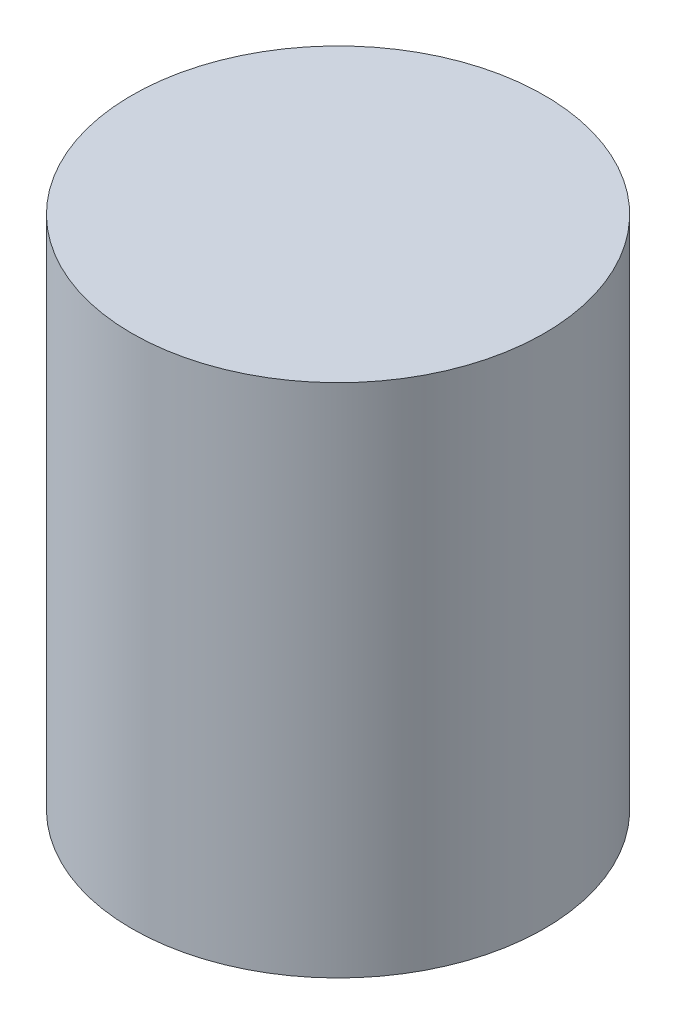
ISO-10303-21;
HEADER;
FILE_DESCRIPTION(('STEP AP214'),'2;1');
FILE_NAME('part.step','',(''),(''),'','','');
FILE_SCHEMA(('AUTOMOTIVE_DESIGN { 1 0 10303 214 1 1 1 1 }'));
ENDSEC;
DATA;
#1=APPLICATION_CONTEXT('core data for automotive mechanical design processes');
#2=APPLICATION_PROTOCOL_DEFINITION('international standard','automotive_design',2000,#1);
#3=PRODUCT_CONTEXT('',#1,'mechanical');
#4=PRODUCT('Part','Part','',(#3));
#5=PRODUCT_RELATED_PRODUCT_CATEGORY('part','',(#4));
#6=PRODUCT_DEFINITION_FORMATION('','',#4);
#7=PRODUCT_DEFINITION_CONTEXT('part definition',#1,'design');
#8=PRODUCT_DEFINITION('design','',#6,#7);
#9=PRODUCT_DEFINITION_SHAPE('','',#8);
#10=(LENGTH_UNIT() NAMED_UNIT(*) SI_UNIT(.MILLI.,.METRE.));
#11=(NAMED_UNIT(*) PLANE_ANGLE_UNIT() SI_UNIT($,.RADIAN.));
#12=(NAMED_UNIT(*) SI_UNIT($,.STERADIAN.) SOLID_ANGLE_UNIT());
#13=UNCERTAINTY_MEASURE_WITH_UNIT(LENGTH_MEASURE(1.E-05),#10,'distance_accuracy_value','');
#14=(GEOMETRIC_REPRESENTATION_CONTEXT(3) GLOBAL_UNCERTAINTY_ASSIGNED_CONTEXT((#13)) GLOBAL_UNIT_ASSIGNED_CONTEXT((#10,
#11,#12)) REPRESENTATION_CONTEXT('',''));
#15=CARTESIAN_POINT('',(0.,0.,0.));
#16=DIRECTION('',(0.,0.,1.));
#17=DIRECTION('',(1.,0.,0.));
#18=AXIS2_PLACEMENT_3D('',#15,#16,#17);
#19=CARTESIAN_POINT('',(0.,50.,0.));
#20=DIRECTION('',(0.,-1.,0.));
#21=DIRECTION('',(0.,0.,-1.));
#22=AXIS2_PLACEMENT_3D('',#19,#20,#21);
#23=CYLINDRICAL_SURFACE('',#22,20.);
#24=CARTESIAN_POINT('',(0.,50.,0.));
#25=DIRECTION('',(0.,1.,0.));
#26=DIRECTION('',(0.,0.,1.));
#27=AXIS2_PLACEMENT_3D('',#24,#25,#26);
#28=CIRCLE('',#27,20.);
#29=CARTESIAN_POINT('',(0.,50.,20.));
#30=VERTEX_POINT('',#29);
#31=EDGE_CURVE('E10',#30,#30,#28,.T.);
#32=ORIENTED_EDGE('',*,*,#31,.F.);
#33=EDGE_LOOP('',(#32));
#34=FACE_BOUND('',#33,.T.);
#35=CARTESIAN_POINT('',(0.,0.,0.));
#36=DIRECTION('',(0.,1.,0.));
#37=DIRECTION('',(0.,0.,1.));
#38=AXIS2_PLACEMENT_3D('',#35,#36,#37);
#39=CIRCLE('',#38,20.);
#40=CARTESIAN_POINT('',(0.,0.,20.));
#41=VERTEX_POINT('',#40);
#42=EDGE_CURVE('E38',#41,#41,#39,.T.);
#43=ORIENTED_EDGE('',*,*,#42,.T.);
#44=EDGE_LOOP('',(#43));
#45=FACE_BOUND('',#44,.T.);
#46=ADVANCED_FACE('F35',(#34,#45),#23,.T.);
#47=CARTESIAN_POINT('',(0.,50.,0.));
#48=DIRECTION('',(0.,1.,0.));
#49=DIRECTION('',(0.,0.,1.));
#50=AXIS2_PLACEMENT_3D('',#47,#48,#49);
#51=PLANE('',#50);
#52=ORIENTED_EDGE('',*,*,#31,.T.);
#53=EDGE_LOOP('',(#52));
#54=FACE_BOUND('',#53,.T.);
#55=ADVANCED_FACE('F50',(#54),#51,.T.);
#56=CARTESIAN_POINT('',(0.,0.,0.));
#57=DIRECTION('',(0.,1.,0.));
#58=DIRECTION('',(0.,0.,1.));
#59=AXIS2_PLACEMENT_3D('',#56,#57,#58);
#60=PLANE('',#59);
#61=ORIENTED_EDGE('',*,*,#42,.F.);
#62=EDGE_LOOP('',(#61));
#63=FACE_BOUND('',#62,.T.);
#64=ADVANCED_FACE('F48',(#63),#60,.F.);
#65=CLOSED_SHELL('',(#46,#55,#64));
#66=MANIFOLD_SOLID_BREP('B2',#65);
#67=ADVANCED_BREP_SHAPE_REPRESENTATION('',(#18,#66),#14);
#68=SHAPE_DEFINITION_REPRESENTATION(#9,#67);
ENDSEC;
END-ISO-10303-21;
